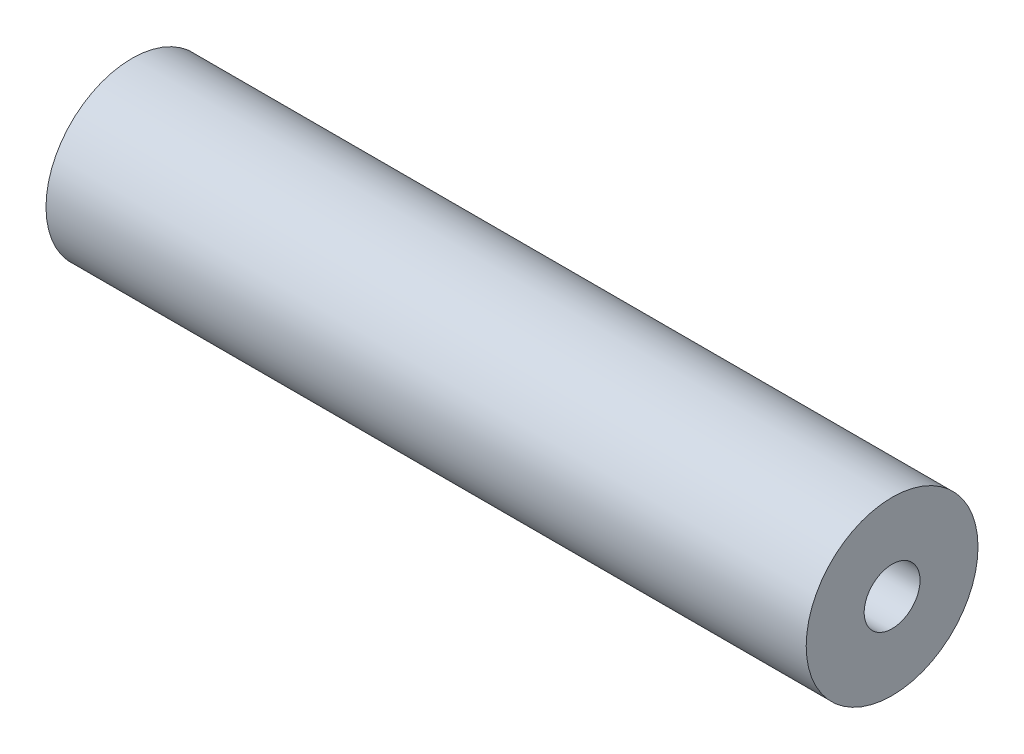
ISO-10303-21;
HEADER;
FILE_DESCRIPTION(('STEP AP214'),'2;1');
FILE_NAME('part.step','',(''),(''),'','','');
FILE_SCHEMA(('AUTOMOTIVE_DESIGN { 1 0 10303 214 1 1 1 1 }'));
ENDSEC;
DATA;
#1=APPLICATION_CONTEXT('core data for automotive mechanical design processes');
#2=APPLICATION_PROTOCOL_DEFINITION('international standard','automotive_design',2000,#1);
#3=PRODUCT_CONTEXT('',#1,'mechanical');
#4=PRODUCT('Part','Part','',(#3));
#5=PRODUCT_RELATED_PRODUCT_CATEGORY('part','',(#4));
#6=PRODUCT_DEFINITION_FORMATION('','',#4);
#7=PRODUCT_DEFINITION_CONTEXT('part definition',#1,'design');
#8=PRODUCT_DEFINITION('design','',#6,#7);
#9=PRODUCT_DEFINITION_SHAPE('','',#8);
#10=(LENGTH_UNIT() NAMED_UNIT(*) SI_UNIT(.MILLI.,.METRE.));
#11=(NAMED_UNIT(*) PLANE_ANGLE_UNIT() SI_UNIT($,.RADIAN.));
#12=(NAMED_UNIT(*) SI_UNIT($,.STERADIAN.) SOLID_ANGLE_UNIT());
#13=UNCERTAINTY_MEASURE_WITH_UNIT(LENGTH_MEASURE(1.E-05),#10,'distance_accuracy_value','');
#14=(GEOMETRIC_REPRESENTATION_CONTEXT(3) GLOBAL_UNCERTAINTY_ASSIGNED_CONTEXT((#13)) GLOBAL_UNIT_ASSIGNED_CONTEXT((#10,
#11,#12)) REPRESENTATION_CONTEXT('',''));
#15=CARTESIAN_POINT('',(0.,0.,0.));
#16=DIRECTION('',(0.,0.,1.));
#17=DIRECTION('',(1.,0.,0.));
#18=AXIS2_PLACEMENT_3D('',#15,#16,#17);
#19=CARTESIAN_POINT('',(35.4,0.,0.));
#20=DIRECTION('',(-1.,0.,0.));
#21=DIRECTION('',(0.,0.,1.));
#22=AXIS2_PLACEMENT_3D('',#19,#20,#21);
#23=CYLINDRICAL_SURFACE('',#22,4.);
#24=CARTESIAN_POINT('',(35.4,0.,0.));
#25=DIRECTION('',(1.,0.,0.));
#26=DIRECTION('',(0.,0.,-1.));
#27=AXIS2_PLACEMENT_3D('',#24,#25,#26);
#28=CIRCLE('',#27,4.);
#29=CARTESIAN_POINT('',(35.4,0.,-4.));
#30=VERTEX_POINT('',#29);
#31=EDGE_CURVE('E10',#30,#30,#28,.T.);
#32=ORIENTED_EDGE('',*,*,#31,.F.);
#33=EDGE_LOOP('',(#32));
#34=FACE_BOUND('',#33,.T.);
#35=CARTESIAN_POINT('',(0.,0.,0.));
#36=DIRECTION('',(1.,0.,0.));
#37=DIRECTION('',(0.,0.,-1.));
#38=AXIS2_PLACEMENT_3D('',#35,#36,#37);
#39=CIRCLE('',#38,4.);
#40=CARTESIAN_POINT('',(0.,0.,-4.));
#41=VERTEX_POINT('',#40);
#42=EDGE_CURVE('E34',#41,#41,#39,.T.);
#43=ORIENTED_EDGE('',*,*,#42,.T.);
#44=EDGE_LOOP('',(#43));
#45=FACE_BOUND('',#44,.T.);
#46=ADVANCED_FACE('F31',(#34,#45),#23,.T.);
#47=CARTESIAN_POINT('',(35.4,0.,0.));
#48=DIRECTION('',(1.,0.,0.));
#49=DIRECTION('',(0.,0.,-1.));
#50=AXIS2_PLACEMENT_3D('',#47,#48,#49);
#51=PLANE('',#50);
#52=CARTESIAN_POINT('',(35.4,0.,0.));
#53=DIRECTION('',(1.,0.,0.));
#54=DIRECTION('',(0.,0.,-1.));
#55=AXIS2_PLACEMENT_3D('',#52,#53,#54);
#56=CIRCLE('',#55,1.3);
#57=CARTESIAN_POINT('',(35.4,0.,-1.3));
#58=VERTEX_POINT('',#57);
#59=EDGE_CURVE('E43',#58,#58,#56,.T.);
#60=ORIENTED_EDGE('',*,*,#59,.F.);
#61=EDGE_LOOP('',(#60));
#62=FACE_BOUND('',#61,.T.);
#63=ORIENTED_EDGE('',*,*,#31,.T.);
#64=EDGE_LOOP('',(#63));
#65=FACE_BOUND('',#64,.T.);
#66=ADVANCED_FACE('F68',(#62,#65),#51,.T.);
#67=CARTESIAN_POINT('',(0.,0.,0.));
#68=DIRECTION('',(1.,0.,0.));
#69=DIRECTION('',(0.,0.,-1.));
#70=AXIS2_PLACEMENT_3D('',#67,#68,#69);
#71=PLANE('',#70);
#72=CARTESIAN_POINT('',(0.,0.,0.));
#73=DIRECTION('',(-1.,0.,0.));
#74=DIRECTION('',(0.,0.,1.));
#75=AXIS2_PLACEMENT_3D('',#72,#73,#74);
#76=CIRCLE('',#75,1.3);
#77=CARTESIAN_POINT('',(0.,0.,1.3));
#78=VERTEX_POINT('',#77);
#79=EDGE_CURVE('E49',#78,#78,#76,.T.);
#80=ORIENTED_EDGE('',*,*,#79,.F.);
#81=EDGE_LOOP('',(#80));
#82=FACE_BOUND('',#81,.T.);
#83=ORIENTED_EDGE('',*,*,#42,.F.);
#84=EDGE_LOOP('',(#83));
#85=FACE_BOUND('',#84,.T.);
#86=ADVANCED_FACE('F64',(#82,#85),#71,.F.);
#87=CARTESIAN_POINT('',(23.4,0.,0.));
#88=DIRECTION('',(1.,0.,0.));
#89=DIRECTION('',(0.,0.,-1.));
#90=AXIS2_PLACEMENT_3D('',#87,#88,#89);
#91=CYLINDRICAL_SURFACE('',#90,1.3);
#92=CARTESIAN_POINT('',(23.4,0.,0.));
#93=DIRECTION('',(1.,0.,0.));
#94=DIRECTION('',(0.,0.,-1.));
#95=AXIS2_PLACEMENT_3D('',#92,#93,#94);
#96=CIRCLE('',#95,1.3);
#97=CARTESIAN_POINT('',(23.4,0.,-1.3));
#98=VERTEX_POINT('',#97);
#99=EDGE_CURVE('E41',#98,#98,#96,.T.);
#100=ORIENTED_EDGE('',*,*,#99,.F.);
#101=EDGE_LOOP('',(#100));
#102=FACE_BOUND('',#101,.T.);
#103=ORIENTED_EDGE('',*,*,#59,.T.);
#104=EDGE_LOOP('',(#103));
#105=FACE_BOUND('',#104,.T.);
#106=ADVANCED_FACE('F67',(#102,#105),#91,.F.);
#107=CARTESIAN_POINT('',(23.4,0.,0.));
#108=DIRECTION('',(1.,0.,0.));
#109=DIRECTION('',(0.,0.,-1.));
#110=AXIS2_PLACEMENT_3D('',#107,#108,#109);
#111=PLANE('',#110);
#112=ORIENTED_EDGE('',*,*,#99,.T.);
#113=EDGE_LOOP('',(#112));
#114=FACE_BOUND('',#113,.T.);
#115=ADVANCED_FACE('F60',(#114),#111,.T.);
#116=CARTESIAN_POINT('',(12.,0.,0.));
#117=DIRECTION('',(-1.,0.,0.));
#118=DIRECTION('',(0.,0.,1.));
#119=AXIS2_PLACEMENT_3D('',#116,#117,#118);
#120=CYLINDRICAL_SURFACE('',#119,1.3);
#121=CARTESIAN_POINT('',(12.,0.,0.));
#122=DIRECTION('',(-1.,0.,0.));
#123=DIRECTION('',(0.,0.,1.));
#124=AXIS2_PLACEMENT_3D('',#121,#122,#123);
#125=CIRCLE('',#124,1.3);
#126=CARTESIAN_POINT('',(12.,0.,1.3));
#127=VERTEX_POINT('',#126);
#128=EDGE_CURVE('E46',#127,#127,#125,.T.);
#129=ORIENTED_EDGE('',*,*,#128,.F.);
#130=EDGE_LOOP('',(#129));
#131=FACE_BOUND('',#130,.T.);
#132=ORIENTED_EDGE('',*,*,#79,.T.);
#133=EDGE_LOOP('',(#132));
#134=FACE_BOUND('',#133,.T.);
#135=ADVANCED_FACE('F57',(#131,#134),#120,.F.);
#136=CARTESIAN_POINT('',(12.,0.,0.));
#137=DIRECTION('',(-1.,0.,0.));
#138=DIRECTION('',(0.,0.,1.));
#139=AXIS2_PLACEMENT_3D('',#136,#137,#138);
#140=PLANE('',#139);
#141=ORIENTED_EDGE('',*,*,#128,.T.);
#142=EDGE_LOOP('',(#141));
#143=FACE_BOUND('',#142,.T.);
#144=ADVANCED_FACE('F55',(#143),#140,.T.);
#145=CLOSED_SHELL('',(#46,#66,#86,#106,#115,#135,#144));
#146=MANIFOLD_SOLID_BREP('B2',#145);
#147=ADVANCED_BREP_SHAPE_REPRESENTATION('',(#18,#146),#14);
#148=SHAPE_DEFINITION_REPRESENTATION(#9,#147);
ENDSEC;
END-ISO-10303-21;
